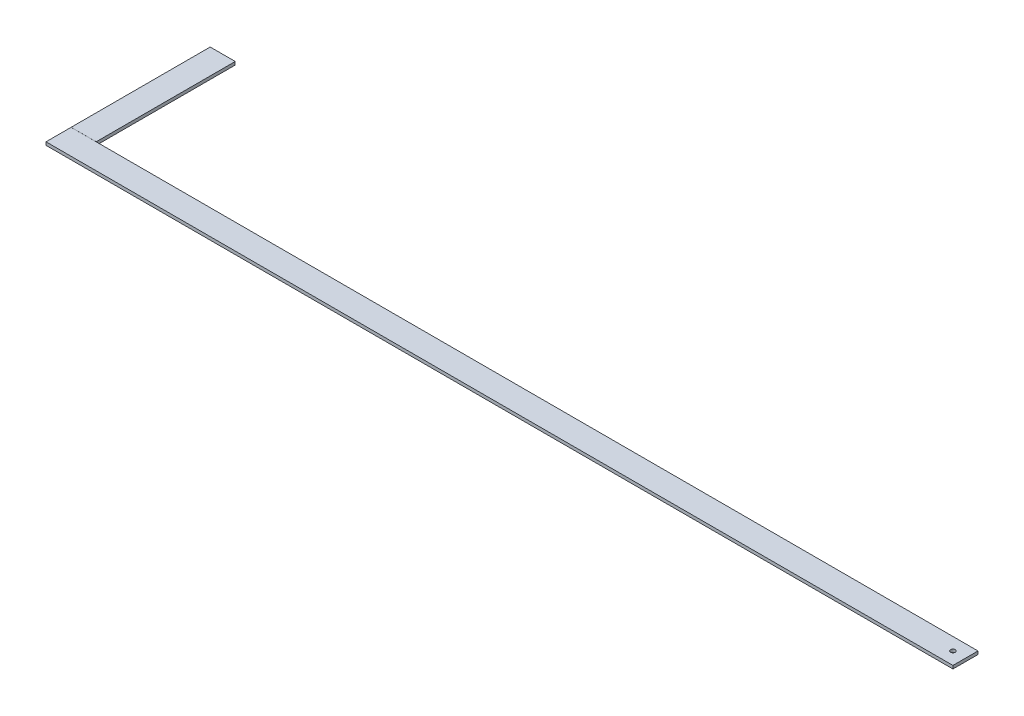
ISO-10303-21;
HEADER;
FILE_DESCRIPTION(('STEP AP214'),'2;1');
FILE_NAME('part.step','',(''),(''),'','','');
FILE_SCHEMA(('AUTOMOTIVE_DESIGN { 1 0 10303 214 1 1 1 1 }'));
ENDSEC;
DATA;
#1=APPLICATION_CONTEXT('core data for automotive mechanical design processes');
#2=APPLICATION_PROTOCOL_DEFINITION('international standard','automotive_design',2000,#1);
#3=PRODUCT_CONTEXT('',#1,'mechanical');
#4=PRODUCT('Part','Part','',(#3));
#5=PRODUCT_RELATED_PRODUCT_CATEGORY('part','',(#4));
#6=PRODUCT_DEFINITION_FORMATION('','',#4);
#7=PRODUCT_DEFINITION_CONTEXT('part definition',#1,'design');
#8=PRODUCT_DEFINITION('design','',#6,#7);
#9=PRODUCT_DEFINITION_SHAPE('','',#8);
#10=(LENGTH_UNIT() NAMED_UNIT(*) SI_UNIT(.MILLI.,.METRE.));
#11=(NAMED_UNIT(*) PLANE_ANGLE_UNIT() SI_UNIT($,.RADIAN.));
#12=(NAMED_UNIT(*) SI_UNIT($,.STERADIAN.) SOLID_ANGLE_UNIT());
#13=UNCERTAINTY_MEASURE_WITH_UNIT(LENGTH_MEASURE(1.E-05),#10,'distance_accuracy_value','');
#14=(GEOMETRIC_REPRESENTATION_CONTEXT(3) GLOBAL_UNCERTAINTY_ASSIGNED_CONTEXT((#13)) GLOBAL_UNIT_ASSIGNED_CONTEXT((#10,
#11,#12)) REPRESENTATION_CONTEXT('',''));
#15=CARTESIAN_POINT('',(0.,0.,0.));
#16=DIRECTION('',(0.,0.,1.));
#17=DIRECTION('',(1.,0.,0.));
#18=AXIS2_PLACEMENT_3D('',#15,#16,#17);
#19=CARTESIAN_POINT('',(1812.7,-67.4999999999998,468.95));
#20=DIRECTION('',(0.,0.,1.));
#21=DIRECTION('',(1.,0.,0.));
#22=AXIS2_PLACEMENT_3D('',#19,#20,#21);
#23=PLANE('',#22);
#24=DIRECTION('',(0.,1.,0.));
#25=VECTOR('',#24,1.);
#26=CARTESIAN_POINT('',(1812.7,-67.4999999999998,468.95));
#27=LINE('',#26,#25);
#28=CARTESIAN_POINT('',(1812.7,-67.4999999999998,468.95));
#29=VERTEX_POINT('',#28);
#30=CARTESIAN_POINT('',(1812.7,-61.1899999999998,468.95));
#31=VERTEX_POINT('',#30);
#32=EDGE_CURVE('E54',#29,#31,#27,.T.);
#33=ORIENTED_EDGE('',*,*,#32,.F.);
#34=DIRECTION('',(1.,0.,0.));
#35=VECTOR('',#34,1.);
#36=CARTESIAN_POINT('',(-25.4,-67.5,468.95));
#37=LINE('',#36,#35);
#38=CARTESIAN_POINT('',(-25.4,-67.5,468.95));
#39=VERTEX_POINT('',#38);
#40=EDGE_CURVE('E60',#39,#29,#37,.T.);
#41=ORIENTED_EDGE('',*,*,#40,.F.);
#42=DIRECTION('',(0.,1.,0.));
#43=VECTOR('',#42,1.);
#44=CARTESIAN_POINT('',(-25.4,-111.99,468.95));
#45=LINE('',#44,#43);
#46=CARTESIAN_POINT('',(-25.4,-61.19,468.95));
#47=VERTEX_POINT('',#46);
#48=EDGE_CURVE('E12',#39,#47,#45,.T.);
#49=ORIENTED_EDGE('',*,*,#48,.T.);
#50=DIRECTION('',(-1.,0.,0.));
#51=VECTOR('',#50,1.);
#52=CARTESIAN_POINT('',(1812.7,-61.1899999999998,468.95));
#53=LINE('',#52,#51);
#54=EDGE_CURVE('E94',#31,#47,#53,.T.);
#55=ORIENTED_EDGE('',*,*,#54,.F.);
#56=EDGE_LOOP('',(#33,#41,#49,#55));
#57=FACE_BOUND('',#56,.T.);
#58=ADVANCED_FACE('F44',(#57),#23,.F.);
#59=CARTESIAN_POINT('',(-25.4,67.5,6.31));
#60=DIRECTION('',(1.,0.,0.));
#61=DIRECTION('',(0.,1.,0.));
#62=AXIS2_PLACEMENT_3D('',#59,#60,#61);
#63=PLANE('',#62);
#64=DIRECTION('',(0.,0.,-1.));
#65=VECTOR('',#64,1.);
#66=CARTESIAN_POINT('',(-25.4,-61.19,519.75));
#67=LINE('',#66,#65);
#68=CARTESIAN_POINT('',(-25.4,-61.19,519.75));
#69=VERTEX_POINT('',#68);
#70=EDGE_CURVE('E48',#69,#47,#67,.T.);
#71=ORIENTED_EDGE('',*,*,#70,.T.);
#72=ORIENTED_EDGE('',*,*,#48,.F.);
#73=DIRECTION('',(0.,0.,-1.));
#74=VECTOR('',#73,1.);
#75=CARTESIAN_POINT('',(-25.4,-67.5,6.31));
#76=LINE('',#75,#74);
#77=CARTESIAN_POINT('',(-25.4,-67.5,519.75));
#78=VERTEX_POINT('',#77);
#79=EDGE_CURVE('E114',#78,#39,#76,.T.);
#80=ORIENTED_EDGE('',*,*,#79,.F.);
#81=DIRECTION('',(0.,-1.,0.));
#82=VECTOR('',#81,1.);
#83=CARTESIAN_POINT('',(-25.4,-61.19,519.75));
#84=LINE('',#83,#82);
#85=EDGE_CURVE('E93',#69,#78,#84,.T.);
#86=ORIENTED_EDGE('',*,*,#85,.F.);
#87=EDGE_LOOP('',(#71,#72,#80,#86));
#88=FACE_BOUND('',#87,.T.);
#89=ADVANCED_FACE('F46',(#88),#63,.F.);
#90=CARTESIAN_POINT('',(1812.7,1.97302717093577E-13,0.));
#91=DIRECTION('',(1.,0.,0.));
#92=DIRECTION('',(0.,0.,-1.));
#93=AXIS2_PLACEMENT_3D('',#90,#91,#92);
#94=PLANE('',#93);
#95=DIRECTION('',(0.,1.,0.));
#96=VECTOR('',#95,1.);
#97=CARTESIAN_POINT('',(1812.7,-111.99,519.75));
#98=LINE('',#97,#96);
#99=CARTESIAN_POINT('',(1812.7,-67.4999999999998,519.75));
#100=VERTEX_POINT('',#99);
#101=CARTESIAN_POINT('',(1812.7,-61.19,519.75));
#102=VERTEX_POINT('',#101);
#103=EDGE_CURVE('E97',#100,#102,#98,.T.);
#104=ORIENTED_EDGE('',*,*,#103,.F.);
#105=DIRECTION('',(0.,0.,-1.));
#106=VECTOR('',#105,1.);
#107=CARTESIAN_POINT('',(1812.7,-67.4999999999998,468.95));
#108=LINE('',#107,#106);
#109=EDGE_CURVE('E107',#100,#29,#108,.T.);
#110=ORIENTED_EDGE('',*,*,#109,.T.);
#111=ORIENTED_EDGE('',*,*,#32,.T.);
#112=DIRECTION('',(0.,0.,1.));
#113=VECTOR('',#112,1.);
#114=CARTESIAN_POINT('',(1812.7,-61.1899999999998,468.95));
#115=LINE('',#114,#113);
#116=EDGE_CURVE('E88',#31,#102,#115,.T.);
#117=ORIENTED_EDGE('',*,*,#116,.T.);
#118=EDGE_LOOP('',(#104,#110,#111,#117));
#119=FACE_BOUND('',#118,.T.);
#120=ADVANCED_FACE('F105',(#119),#94,.T.);
#121=CARTESIAN_POINT('',(0.,0.,519.75));
#122=DIRECTION('',(0.,0.,1.));
#123=DIRECTION('',(1.,0.,0.));
#124=AXIS2_PLACEMENT_3D('',#121,#122,#123);
#125=PLANE('',#124);
#126=DIRECTION('',(1.,0.,0.));
#127=VECTOR('',#126,1.);
#128=CARTESIAN_POINT('',(-25.4,-67.5,519.75));
#129=LINE('',#128,#127);
#130=EDGE_CURVE('E100',#78,#100,#129,.T.);
#131=ORIENTED_EDGE('',*,*,#130,.T.);
#132=ORIENTED_EDGE('',*,*,#103,.T.);
#133=DIRECTION('',(-1.,0.,0.));
#134=VECTOR('',#133,1.);
#135=CARTESIAN_POINT('',(-25.4,-61.19,519.75));
#136=LINE('',#135,#134);
#137=EDGE_CURVE('E84',#102,#69,#136,.T.);
#138=ORIENTED_EDGE('',*,*,#137,.T.);
#139=ORIENTED_EDGE('',*,*,#85,.T.);
#140=EDGE_LOOP('',(#131,#132,#138,#139));
#141=FACE_BOUND('',#140,.T.);
#142=ADVANCED_FACE('F98',(#141),#125,.T.);
#143=CARTESIAN_POINT('',(-25.4,-61.19,519.75));
#144=DIRECTION('',(0.,-1.,0.));
#145=DIRECTION('',(0.,0.,-1.));
#146=AXIS2_PLACEMENT_3D('',#143,#144,#145);
#147=PLANE('',#146);
#148=CARTESIAN_POINT('',(1787.3,-61.19,494.35));
#149=DIRECTION('',(0.,-1.,0.));
#150=DIRECTION('',(0.,0.,-1.));
#151=AXIS2_PLACEMENT_3D('',#148,#149,#150);
#152=CIRCLE('',#151,4.76249999999989);
#153=CARTESIAN_POINT('',(1787.3,-61.19,489.5875));
#154=VERTEX_POINT('',#153);
#155=EDGE_CURVE('E103',#154,#154,#152,.T.);
#156=ORIENTED_EDGE('',*,*,#155,.T.);
#157=EDGE_LOOP('',(#156));
#158=FACE_BOUND('',#157,.T.);
#159=ORIENTED_EDGE('',*,*,#137,.F.);
#160=ORIENTED_EDGE('',*,*,#116,.F.);
#161=ORIENTED_EDGE('',*,*,#54,.T.);
#162=ORIENTED_EDGE('',*,*,#70,.F.);
#163=EDGE_LOOP('',(#159,#160,#161,#162));
#164=FACE_BOUND('',#163,.T.);
#165=ADVANCED_FACE('F86',(#158,#164),#147,.F.);
#166=CARTESIAN_POINT('',(-25.4,-67.5,6.31));
#167=DIRECTION('',(0.,1.,0.));
#168=DIRECTION('',(0.,0.,1.));
#169=AXIS2_PLACEMENT_3D('',#166,#167,#168);
#170=PLANE('',#169);
#171=CARTESIAN_POINT('',(1787.3,-67.5,494.35));
#172=DIRECTION('',(0.,-1.,0.));
#173=DIRECTION('',(0.,0.,-1.));
#174=AXIS2_PLACEMENT_3D('',#171,#172,#173);
#175=CIRCLE('',#174,4.76249999999989);
#176=CARTESIAN_POINT('',(1787.3,-67.5,489.5875));
#177=VERTEX_POINT('',#176);
#178=EDGE_CURVE('E122',#177,#177,#175,.T.);
#179=ORIENTED_EDGE('',*,*,#178,.F.);
#180=EDGE_LOOP('',(#179));
#181=FACE_BOUND('',#180,.T.);
#182=ORIENTED_EDGE('',*,*,#109,.F.);
#183=ORIENTED_EDGE('',*,*,#130,.F.);
#184=ORIENTED_EDGE('',*,*,#79,.T.);
#185=ORIENTED_EDGE('',*,*,#40,.T.);
#186=EDGE_LOOP('',(#182,#183,#184,#185));
#187=FACE_BOUND('',#186,.T.);
#188=ADVANCED_FACE('F129',(#181,#187),#170,.F.);
#189=CARTESIAN_POINT('',(1787.3,-17.5,494.35));
#190=DIRECTION('',(0.,-1.,0.));
#191=DIRECTION('',(0.,0.,-1.));
#192=AXIS2_PLACEMENT_3D('',#189,#190,#191);
#193=CYLINDRICAL_SURFACE('',#192,4.76249999999989);
#194=ORIENTED_EDGE('',*,*,#178,.T.);
#195=EDGE_LOOP('',(#194));
#196=FACE_BOUND('',#195,.T.);
#197=ORIENTED_EDGE('',*,*,#155,.F.);
#198=EDGE_LOOP('',(#197));
#199=FACE_BOUND('',#198,.T.);
#200=ADVANCED_FACE('F126',(#196,#199),#193,.F.);
#201=CLOSED_SHELL('',(#58,#89,#120,#142,#165,#188,#200));
#202=MANIFOLD_SOLID_BREP('B2',#201);
#203=CARTESIAN_POINT('',(-25.4,-61.19,519.75));
#204=DIRECTION('',(0.,-1.,0.));
#205=DIRECTION('',(0.,0.,-1.));
#206=AXIS2_PLACEMENT_3D('',#203,#204,#205);
#207=PLANE('',#206);
#208=DIRECTION('',(0.,0.,-1.));
#209=VECTOR('',#208,1.);
#210=CARTESIAN_POINT('',(25.4,-61.19,519.75));
#211=LINE('',#210,#209);
#212=CARTESIAN_POINT('',(25.4,-61.19,468.85));
#213=VERTEX_POINT('',#212);
#214=CARTESIAN_POINT('',(25.4,-61.19,187.));
#215=VERTEX_POINT('',#214);
#216=EDGE_CURVE('E273',#213,#215,#211,.T.);
#217=ORIENTED_EDGE('',*,*,#216,.T.);
#218=DIRECTION('',(1.,0.,0.));
#219=VECTOR('',#218,1.);
#220=CARTESIAN_POINT('',(-25.4,-61.19,187.));
#221=LINE('',#220,#219);
#222=CARTESIAN_POINT('',(-25.4,-61.19,187.));
#223=VERTEX_POINT('',#222);
#224=EDGE_CURVE('E236',#223,#215,#221,.T.);
#225=ORIENTED_EDGE('',*,*,#224,.F.);
#226=DIRECTION('',(0.,0.,-1.));
#227=VECTOR('',#226,1.);
#228=CARTESIAN_POINT('',(-25.4,-61.19,519.75));
#229=LINE('',#228,#227);
#230=CARTESIAN_POINT('',(-25.4,-61.19,468.85));
#231=VERTEX_POINT('',#230);
#232=EDGE_CURVE('E271',#231,#223,#229,.T.);
#233=ORIENTED_EDGE('',*,*,#232,.F.);
#234=DIRECTION('',(-1.,0.,0.));
#235=VECTOR('',#234,1.);
#236=CARTESIAN_POINT('',(-25.4,-61.19,468.85));
#237=LINE('',#236,#235);
#238=EDGE_CURVE('E292',#213,#231,#237,.T.);
#239=ORIENTED_EDGE('',*,*,#238,.F.);
#240=EDGE_LOOP('',(#217,#225,#233,#239));
#241=FACE_BOUND('',#240,.T.);
#242=ADVANCED_FACE('F221',(#241),#207,.F.);
#243=CARTESIAN_POINT('',(-25.4,-67.5,6.31));
#244=DIRECTION('',(0.,1.,0.));
#245=DIRECTION('',(0.,0.,1.));
#246=AXIS2_PLACEMENT_3D('',#243,#244,#245);
#247=PLANE('',#246);
#248=DIRECTION('',(0.,0.,-1.));
#249=VECTOR('',#248,1.);
#250=CARTESIAN_POINT('',(-25.4,-67.5,6.31));
#251=LINE('',#250,#249);
#252=CARTESIAN_POINT('',(-25.4,-67.5,468.85));
#253=VERTEX_POINT('',#252);
#254=CARTESIAN_POINT('',(-25.4,-67.5,187.));
#255=VERTEX_POINT('',#254);
#256=EDGE_CURVE('E229',#253,#255,#251,.T.);
#257=ORIENTED_EDGE('',*,*,#256,.T.);
#258=DIRECTION('',(1.,0.,0.));
#259=VECTOR('',#258,1.);
#260=CARTESIAN_POINT('',(-25.4,-67.5,187.));
#261=LINE('',#260,#259);
#262=CARTESIAN_POINT('',(25.4,-67.5,187.));
#263=VERTEX_POINT('',#262);
#264=EDGE_CURVE('E262',#255,#263,#261,.T.);
#265=ORIENTED_EDGE('',*,*,#264,.T.);
#266=DIRECTION('',(0.,0.,-1.));
#267=VECTOR('',#266,1.);
#268=CARTESIAN_POINT('',(25.4,-67.5,6.31));
#269=LINE('',#268,#267);
#270=CARTESIAN_POINT('',(25.4,-67.5,468.85));
#271=VERTEX_POINT('',#270);
#272=EDGE_CURVE('E280',#271,#263,#269,.T.);
#273=ORIENTED_EDGE('',*,*,#272,.F.);
#274=DIRECTION('',(-1.,0.,0.));
#275=VECTOR('',#274,1.);
#276=CARTESIAN_POINT('',(-25.4,-67.5,468.85));
#277=LINE('',#276,#275);
#278=EDGE_CURVE('E278',#271,#253,#277,.T.);
#279=ORIENTED_EDGE('',*,*,#278,.T.);
#280=EDGE_LOOP('',(#257,#265,#273,#279));
#281=FACE_BOUND('',#280,.T.);
#282=ADVANCED_FACE('F288',(#281),#247,.F.);
#283=CARTESIAN_POINT('',(-25.4,67.5,6.31));
#284=DIRECTION('',(1.,0.,0.));
#285=DIRECTION('',(0.,1.,0.));
#286=AXIS2_PLACEMENT_3D('',#283,#284,#285);
#287=PLANE('',#286);
#288=ORIENTED_EDGE('',*,*,#232,.T.);
#289=DIRECTION('',(0.,1.,0.));
#290=VECTOR('',#289,1.);
#291=CARTESIAN_POINT('',(-25.4,-135.19,187.));
#292=LINE('',#291,#290);
#293=EDGE_CURVE('E259',#255,#223,#292,.T.);
#294=ORIENTED_EDGE('',*,*,#293,.F.);
#295=ORIENTED_EDGE('',*,*,#256,.F.);
#296=DIRECTION('',(0.,1.,0.));
#297=VECTOR('',#296,1.);
#298=CARTESIAN_POINT('',(-25.4,-111.99,468.85));
#299=LINE('',#298,#297);
#300=EDGE_CURVE('E277',#253,#231,#299,.T.);
#301=ORIENTED_EDGE('',*,*,#300,.T.);
#302=EDGE_LOOP('',(#288,#294,#295,#301));
#303=FACE_BOUND('',#302,.T.);
#304=ADVANCED_FACE('F276',(#303),#287,.F.);
#305=CARTESIAN_POINT('',(25.4,67.5,6.31));
#306=DIRECTION('',(-1.,0.,0.));
#307=DIRECTION('',(0.,-1.,0.));
#308=AXIS2_PLACEMENT_3D('',#305,#306,#307);
#309=PLANE('',#308);
#310=ORIENTED_EDGE('',*,*,#272,.T.);
#311=DIRECTION('',(0.,1.,0.));
#312=VECTOR('',#311,1.);
#313=CARTESIAN_POINT('',(25.4,67.5,187.));
#314=LINE('',#313,#312);
#315=EDGE_CURVE('E42',#263,#215,#314,.T.);
#316=ORIENTED_EDGE('',*,*,#315,.T.);
#317=ORIENTED_EDGE('',*,*,#216,.F.);
#318=DIRECTION('',(0.,1.,0.));
#319=VECTOR('',#318,1.);
#320=CARTESIAN_POINT('',(25.4,-111.99,468.85));
#321=LINE('',#320,#319);
#322=EDGE_CURVE('E243',#271,#213,#321,.T.);
#323=ORIENTED_EDGE('',*,*,#322,.F.);
#324=EDGE_LOOP('',(#310,#316,#317,#323));
#325=FACE_BOUND('',#324,.T.);
#326=ADVANCED_FACE('F223',(#325),#309,.F.);
#327=CARTESIAN_POINT('',(-25.4,-111.99,468.85));
#328=DIRECTION('',(0.,0.,-1.));
#329=DIRECTION('',(-1.,0.,0.));
#330=AXIS2_PLACEMENT_3D('',#327,#328,#329);
#331=PLANE('',#330);
#332=ORIENTED_EDGE('',*,*,#322,.T.);
#333=ORIENTED_EDGE('',*,*,#238,.T.);
#334=ORIENTED_EDGE('',*,*,#300,.F.);
#335=ORIENTED_EDGE('',*,*,#278,.F.);
#336=EDGE_LOOP('',(#332,#333,#334,#335));
#337=FACE_BOUND('',#336,.T.);
#338=ADVANCED_FACE('F290',(#337),#331,.F.);
#339=CARTESIAN_POINT('',(-25.4,-135.19,187.));
#340=DIRECTION('',(0.,0.,1.));
#341=DIRECTION('',(1.,0.,0.));
#342=AXIS2_PLACEMENT_3D('',#339,#340,#341);
#343=PLANE('',#342);
#344=ORIENTED_EDGE('',*,*,#293,.T.);
#345=ORIENTED_EDGE('',*,*,#224,.T.);
#346=ORIENTED_EDGE('',*,*,#315,.F.);
#347=ORIENTED_EDGE('',*,*,#264,.F.);
#348=EDGE_LOOP('',(#344,#345,#346,#347));
#349=FACE_BOUND('',#348,.T.);
#350=ADVANCED_FACE('F260',(#349),#343,.F.);
#351=CLOSED_SHELL('',(#242,#282,#304,#326,#338,#350));
#352=MANIFOLD_SOLID_BREP('B6',#351);
#353=ADVANCED_BREP_SHAPE_REPRESENTATION('',(#18,#202,#352),#14);
#354=SHAPE_DEFINITION_REPRESENTATION(#9,#353);
ENDSEC;
END-ISO-10303-21;
